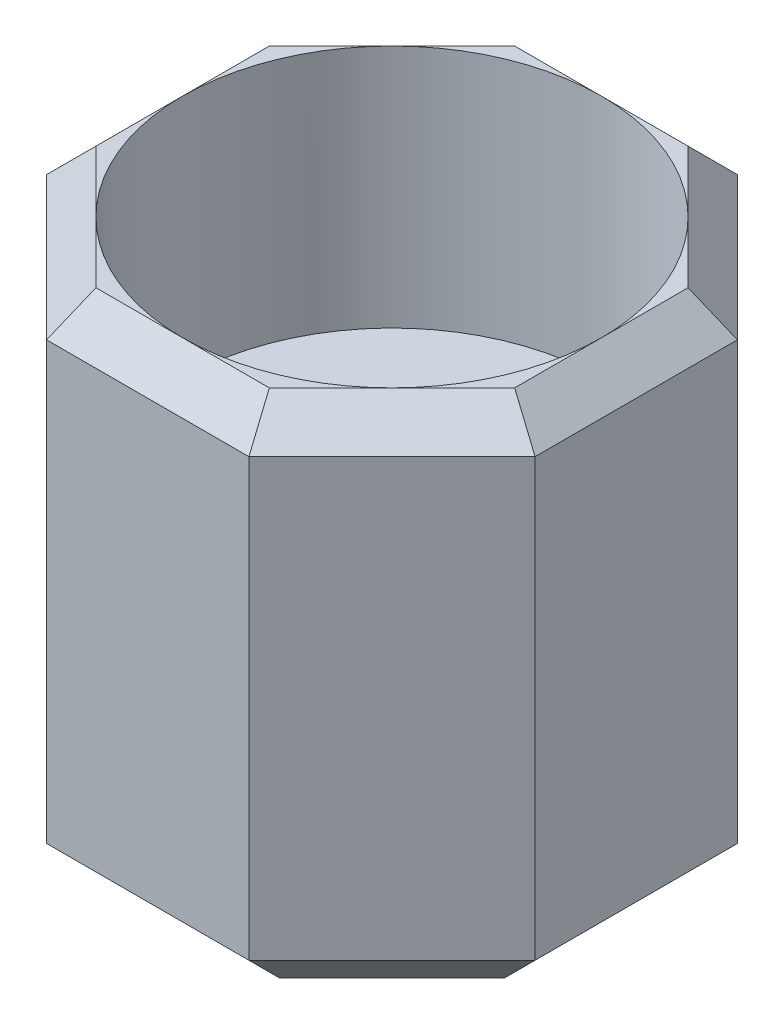
ISO-10303-21;
HEADER;
FILE_DESCRIPTION(('STEP AP214'),'2;1');
FILE_NAME('part.step','',(''),(''),'','','');
FILE_SCHEMA(('AUTOMOTIVE_DESIGN { 1 0 10303 214 1 1 1 1 }'));
ENDSEC;
DATA;
#1=APPLICATION_CONTEXT('core data for automotive mechanical design processes');
#2=APPLICATION_PROTOCOL_DEFINITION('international standard','automotive_design',2000,#1);
#3=PRODUCT_CONTEXT('',#1,'mechanical');
#4=PRODUCT('Part','Part','',(#3));
#5=PRODUCT_RELATED_PRODUCT_CATEGORY('part','',(#4));
#6=PRODUCT_DEFINITION_FORMATION('','',#4);
#7=PRODUCT_DEFINITION_CONTEXT('part definition',#1,'design');
#8=PRODUCT_DEFINITION('design','',#6,#7);
#9=PRODUCT_DEFINITION_SHAPE('','',#8);
#10=(LENGTH_UNIT() NAMED_UNIT(*) SI_UNIT(.MILLI.,.METRE.));
#11=(NAMED_UNIT(*) PLANE_ANGLE_UNIT() SI_UNIT($,.RADIAN.));
#12=(NAMED_UNIT(*) SI_UNIT($,.STERADIAN.) SOLID_ANGLE_UNIT());
#13=UNCERTAINTY_MEASURE_WITH_UNIT(LENGTH_MEASURE(1.E-05),#10,'distance_accuracy_value','');
#14=(GEOMETRIC_REPRESENTATION_CONTEXT(3) GLOBAL_UNCERTAINTY_ASSIGNED_CONTEXT((#13)) GLOBAL_UNIT_ASSIGNED_CONTEXT((#10,
#11,#12)) REPRESENTATION_CONTEXT('',''));
#15=CARTESIAN_POINT('',(0.,0.,0.));
#16=DIRECTION('',(0.,0.,1.));
#17=DIRECTION('',(1.,0.,0.));
#18=AXIS2_PLACEMENT_3D('',#15,#16,#17);
#19=CARTESIAN_POINT('',(0.,15.,0.));
#20=DIRECTION('',(0.,1.,0.));
#21=DIRECTION('',(0.,0.,1.));
#22=AXIS2_PLACEMENT_3D('',#19,#20,#21);
#23=PLANE('',#22);
#24=CARTESIAN_POINT('',(0.,15.,0.));
#25=DIRECTION('',(0.,1.,0.));
#26=DIRECTION('',(0.,0.,1.));
#27=AXIS2_PLACEMENT_3D('',#24,#25,#26);
#28=CIRCLE('',#27,6.);
#29=CARTESIAN_POINT('',(0.,15.,6.));
#30=VERTEX_POINT('',#29);
#31=CARTESIAN_POINT('',(4.24264068711928,15.,4.24264068711928));
#32=VERTEX_POINT('',#31);
#33=EDGE_CURVE('E449',#30,#32,#28,.T.);
#34=ORIENTED_EDGE('',*,*,#33,.F.);
#35=DIRECTION('',(1.,0.,0.));
#36=VECTOR('',#35,1.);
#37=CARTESIAN_POINT('',(2.89949493661167,15.,6.));
#38=LINE('',#37,#36);
#39=CARTESIAN_POINT('',(2.48528137423857,15.,6.));
#40=VERTEX_POINT('',#39);
#41=EDGE_CURVE('E249',#30,#40,#38,.T.);
#42=ORIENTED_EDGE('',*,*,#41,.T.);
#43=DIRECTION('',(0.707106781186548,0.,-0.707106781186548));
#44=VECTOR('',#43,1.);
#45=CARTESIAN_POINT('',(6.29289321881345,15.,2.19238815542512));
#46=LINE('',#45,#44);
#47=EDGE_CURVE('E254',#40,#32,#46,.T.);
#48=ORIENTED_EDGE('',*,*,#47,.T.);
#49=EDGE_LOOP('',(#34,#42,#48));
#50=FACE_BOUND('',#49,.T.);
#51=ADVANCED_FACE('F37',(#50),#23,.T.);
#52=CARTESIAN_POINT('',(6.,15.,0.));
#53=VERTEX_POINT('',#52);
#54=EDGE_CURVE('E454',#32,#53,#28,.T.);
#55=ORIENTED_EDGE('',*,*,#54,.F.);
#56=CARTESIAN_POINT('',(6.,15.,2.48528137423857));
#57=VERTEX_POINT('',#56);
#58=EDGE_CURVE('E253',#32,#57,#46,.T.);
#59=ORIENTED_EDGE('',*,*,#58,.T.);
#60=DIRECTION('',(0.,0.,-1.));
#61=VECTOR('',#60,1.);
#62=CARTESIAN_POINT('',(6.,15.,-2.89949493661166));
#63=LINE('',#62,#61);
#64=EDGE_CURVE('E258',#57,#53,#63,.T.);
#65=ORIENTED_EDGE('',*,*,#64,.T.);
#66=EDGE_LOOP('',(#55,#59,#65));
#67=FACE_BOUND('',#66,.T.);
#68=ADVANCED_FACE('F184',(#67),#23,.T.);
#69=CARTESIAN_POINT('',(4.24264068711928,15.,-4.24264068711928));
#70=VERTEX_POINT('',#69);
#71=EDGE_CURVE('E457',#53,#70,#28,.T.);
#72=ORIENTED_EDGE('',*,*,#71,.F.);
#73=CARTESIAN_POINT('',(6.,15.,-2.48528137423857));
#74=VERTEX_POINT('',#73);
#75=EDGE_CURVE('E257',#53,#74,#63,.T.);
#76=ORIENTED_EDGE('',*,*,#75,.T.);
#77=DIRECTION('',(-0.707106781186548,0.,-0.707106781186548));
#78=VECTOR('',#77,1.);
#79=CARTESIAN_POINT('',(4.24264068711928,15.,-4.24264068711928));
#80=LINE('',#79,#78);
#81=EDGE_CURVE('E397',#74,#70,#80,.T.);
#82=ORIENTED_EDGE('',*,*,#81,.T.);
#83=EDGE_LOOP('',(#72,#76,#82));
#84=FACE_BOUND('',#83,.T.);
#85=ADVANCED_FACE('F191',(#84),#23,.T.);
#86=CARTESIAN_POINT('',(0.,15.,-6.));
#87=VERTEX_POINT('',#86);
#88=EDGE_CURVE('E459',#70,#87,#28,.T.);
#89=ORIENTED_EDGE('',*,*,#88,.F.);
#90=CARTESIAN_POINT('',(2.48528137423857,15.,-6.));
#91=VERTEX_POINT('',#90);
#92=EDGE_CURVE('E396',#70,#91,#80,.T.);
#93=ORIENTED_EDGE('',*,*,#92,.T.);
#94=DIRECTION('',(-1.,0.,0.));
#95=VECTOR('',#94,1.);
#96=CARTESIAN_POINT('',(0.,15.,-6.));
#97=LINE('',#96,#95);
#98=EDGE_CURVE('E400',#91,#87,#97,.T.);
#99=ORIENTED_EDGE('',*,*,#98,.T.);
#100=EDGE_LOOP('',(#89,#93,#99));
#101=FACE_BOUND('',#100,.T.);
#102=ADVANCED_FACE('F612',(#101),#23,.T.);
#103=CARTESIAN_POINT('',(-4.24264068711928,15.,-4.24264068711928));
#104=VERTEX_POINT('',#103);
#105=EDGE_CURVE('E410',#87,#104,#28,.T.);
#106=ORIENTED_EDGE('',*,*,#105,.F.);
#107=CARTESIAN_POINT('',(-2.48528137423857,15.,-6.));
#108=VERTEX_POINT('',#107);
#109=EDGE_CURVE('E399',#87,#108,#97,.T.);
#110=ORIENTED_EDGE('',*,*,#109,.T.);
#111=DIRECTION('',(-0.707106781186548,0.,0.707106781186548));
#112=VECTOR('',#111,1.);
#113=CARTESIAN_POINT('',(-4.24264068711928,15.,-4.24264068711928));
#114=LINE('',#113,#112);
#115=EDGE_CURVE('E239',#108,#104,#114,.T.);
#116=ORIENTED_EDGE('',*,*,#115,.T.);
#117=EDGE_LOOP('',(#106,#110,#116));
#118=FACE_BOUND('',#117,.T.);
#119=ADVANCED_FACE('F220',(#118),#23,.T.);
#120=CARTESIAN_POINT('',(-6.,15.,0.));
#121=VERTEX_POINT('',#120);
#122=EDGE_CURVE('E228',#104,#121,#28,.T.);
#123=ORIENTED_EDGE('',*,*,#122,.F.);
#124=CARTESIAN_POINT('',(-6.,15.,-2.48528137423857));
#125=VERTEX_POINT('',#124);
#126=EDGE_CURVE('E243',#104,#125,#114,.T.);
#127=ORIENTED_EDGE('',*,*,#126,.T.);
#128=DIRECTION('',(0.,0.,1.));
#129=VECTOR('',#128,1.);
#130=CARTESIAN_POINT('',(-6.,15.,0.));
#131=LINE('',#130,#129);
#132=EDGE_CURVE('E234',#125,#121,#131,.T.);
#133=ORIENTED_EDGE('',*,*,#132,.T.);
#134=EDGE_LOOP('',(#123,#127,#133));
#135=FACE_BOUND('',#134,.T.);
#136=ADVANCED_FACE('F211',(#135),#23,.T.);
#137=CARTESIAN_POINT('',(-4.24264068711928,15.,4.24264068711928));
#138=VERTEX_POINT('',#137);
#139=EDGE_CURVE('E53',#121,#138,#28,.T.);
#140=ORIENTED_EDGE('',*,*,#139,.F.);
#141=CARTESIAN_POINT('',(-6.,15.,2.48528137423857));
#142=VERTEX_POINT('',#141);
#143=EDGE_CURVE('E224',#121,#142,#131,.T.);
#144=ORIENTED_EDGE('',*,*,#143,.T.);
#145=DIRECTION('',(0.707106781186548,0.,0.707106781186548));
#146=VECTOR('',#145,1.);
#147=CARTESIAN_POINT('',(-2.19238815542512,15.,6.29289321881345));
#148=LINE('',#147,#146);
#149=EDGE_CURVE('E227',#142,#138,#148,.T.);
#150=ORIENTED_EDGE('',*,*,#149,.T.);
#151=EDGE_LOOP('',(#140,#144,#150));
#152=FACE_BOUND('',#151,.T.);
#153=ADVANCED_FACE('F199',(#152),#23,.T.);
#154=CARTESIAN_POINT('',(4.94974746830583,15.,-4.94974746830583));
#155=DIRECTION('',(0.707106781186547,0.,-0.707106781186547));
#156=DIRECTION('',(-0.707106781186548,0.,-0.707106781186548));
#157=AXIS2_PLACEMENT_3D('',#154,#155,#156);
#158=PLANE('',#157);
#159=DIRECTION('',(0.,-1.,0.));
#160=VECTOR('',#159,1.);
#161=CARTESIAN_POINT('',(7.,15.,-2.89949493661166));
#162=LINE('',#161,#160);
#163=CARTESIAN_POINT('',(7.,14.,-2.89949493661166));
#164=VERTEX_POINT('',#163);
#165=CARTESIAN_POINT('',(7.,1.50000000000001,-2.89949493661166));
#166=VERTEX_POINT('',#165);
#167=EDGE_CURVE('E300',#164,#166,#162,.T.);
#168=ORIENTED_EDGE('',*,*,#167,.T.);
#169=DIRECTION('',(-0.707106781186548,0.,-0.707106781186548));
#170=VECTOR('',#169,1.);
#171=CARTESIAN_POINT('',(2.89949493661166,1.50000000000001,-7.));
#172=LINE('',#171,#170);
#173=CARTESIAN_POINT('',(2.89949493661166,1.50000000000001,-7.));
#174=VERTEX_POINT('',#173);
#175=EDGE_CURVE('E46',#166,#174,#172,.T.);
#176=ORIENTED_EDGE('',*,*,#175,.T.);
#177=DIRECTION('',(0.,-1.,0.));
#178=VECTOR('',#177,1.);
#179=CARTESIAN_POINT('',(2.89949493661166,15.,-7.));
#180=LINE('',#179,#178);
#181=CARTESIAN_POINT('',(2.89949493661166,14.,-7.));
#182=VERTEX_POINT('',#181);
#183=EDGE_CURVE('E393',#182,#174,#180,.T.);
#184=ORIENTED_EDGE('',*,*,#183,.F.);
#185=DIRECTION('',(0.707106781186548,0.,0.707106781186548));
#186=VECTOR('',#185,1.);
#187=CARTESIAN_POINT('',(4.94974746830583,14.,-4.94974746830583));
#188=LINE('',#187,#186);
#189=EDGE_CURVE('E276',#182,#164,#188,.T.);
#190=ORIENTED_EDGE('',*,*,#189,.T.);
#191=EDGE_LOOP('',(#168,#176,#184,#190));
#192=FACE_BOUND('',#191,.T.);
#193=ADVANCED_FACE('F210',(#192),#158,.T.);
#194=CARTESIAN_POINT('',(0.,15.,-7.));
#195=DIRECTION('',(0.,0.,-1.));
#196=DIRECTION('',(-1.,0.,0.));
#197=AXIS2_PLACEMENT_3D('',#194,#195,#196);
#198=PLANE('',#197);
#199=ORIENTED_EDGE('',*,*,#183,.T.);
#200=DIRECTION('',(-1.,0.,0.));
#201=VECTOR('',#200,1.);
#202=CARTESIAN_POINT('',(-2.89949493661167,1.50000000000001,-7.));
#203=LINE('',#202,#201);
#204=CARTESIAN_POINT('',(-2.89949493661167,1.50000000000001,-7.));
#205=VERTEX_POINT('',#204);
#206=EDGE_CURVE('E317',#174,#205,#203,.T.);
#207=ORIENTED_EDGE('',*,*,#206,.T.);
#208=DIRECTION('',(0.,-1.,0.));
#209=VECTOR('',#208,1.);
#210=CARTESIAN_POINT('',(-2.89949493661167,15.,-7.));
#211=LINE('',#210,#209);
#212=CARTESIAN_POINT('',(-2.89949493661167,14.,-7.));
#213=VERTEX_POINT('',#212);
#214=EDGE_CURVE('E390',#213,#205,#211,.T.);
#215=ORIENTED_EDGE('',*,*,#214,.F.);
#216=DIRECTION('',(1.,0.,0.));
#217=VECTOR('',#216,1.);
#218=CARTESIAN_POINT('',(0.,14.,-7.));
#219=LINE('',#218,#217);
#220=EDGE_CURVE('E274',#213,#182,#219,.T.);
#221=ORIENTED_EDGE('',*,*,#220,.T.);
#222=EDGE_LOOP('',(#199,#207,#215,#221));
#223=FACE_BOUND('',#222,.T.);
#224=ADVANCED_FACE('F217',(#223),#198,.T.);
#225=CARTESIAN_POINT('',(-4.94974746830583,15.,-4.94974746830583));
#226=DIRECTION('',(-0.707106781186547,0.,-0.707106781186547));
#227=DIRECTION('',(-0.707106781186548,0.,0.707106781186548));
#228=AXIS2_PLACEMENT_3D('',#225,#226,#227);
#229=PLANE('',#228);
#230=ORIENTED_EDGE('',*,*,#214,.T.);
#231=DIRECTION('',(-0.707106781186548,0.,0.707106781186548));
#232=VECTOR('',#231,1.);
#233=CARTESIAN_POINT('',(-7.,1.50000000000001,-2.89949493661167));
#234=LINE('',#233,#232);
#235=CARTESIAN_POINT('',(-7.,1.50000000000001,-2.89949493661167));
#236=VERTEX_POINT('',#235);
#237=EDGE_CURVE('E320',#205,#236,#234,.T.);
#238=ORIENTED_EDGE('',*,*,#237,.T.);
#239=DIRECTION('',(0.,-1.,0.));
#240=VECTOR('',#239,1.);
#241=CARTESIAN_POINT('',(-7.,15.,-2.89949493661167));
#242=LINE('',#241,#240);
#243=CARTESIAN_POINT('',(-7.,14.,-2.89949493661167));
#244=VERTEX_POINT('',#243);
#245=EDGE_CURVE('E387',#244,#236,#242,.T.);
#246=ORIENTED_EDGE('',*,*,#245,.F.);
#247=DIRECTION('',(0.707106781186548,0.,-0.707106781186548));
#248=VECTOR('',#247,1.);
#249=CARTESIAN_POINT('',(-4.94974746830583,14.,-4.94974746830583));
#250=LINE('',#249,#248);
#251=EDGE_CURVE('E272',#244,#213,#250,.T.);
#252=ORIENTED_EDGE('',*,*,#251,.T.);
#253=EDGE_LOOP('',(#230,#238,#246,#252));
#254=FACE_BOUND('',#253,.T.);
#255=ADVANCED_FACE('F438',(#254),#229,.T.);
#256=CARTESIAN_POINT('',(-7.,15.,0.));
#257=DIRECTION('',(-1.,0.,0.));
#258=DIRECTION('',(0.,0.,1.));
#259=AXIS2_PLACEMENT_3D('',#256,#257,#258);
#260=PLANE('',#259);
#261=ORIENTED_EDGE('',*,*,#245,.T.);
#262=DIRECTION('',(0.,0.,1.));
#263=VECTOR('',#262,1.);
#264=CARTESIAN_POINT('',(-7.,1.50000000000001,2.89949493661166));
#265=LINE('',#264,#263);
#266=CARTESIAN_POINT('',(-7.,1.50000000000001,2.89949493661166));
#267=VERTEX_POINT('',#266);
#268=EDGE_CURVE('E322',#236,#267,#265,.T.);
#269=ORIENTED_EDGE('',*,*,#268,.T.);
#270=DIRECTION('',(0.,-1.,0.));
#271=VECTOR('',#270,1.);
#272=CARTESIAN_POINT('',(-7.,15.,2.89949493661166));
#273=LINE('',#272,#271);
#274=CARTESIAN_POINT('',(-7.,14.,2.89949493661166));
#275=VERTEX_POINT('',#274);
#276=EDGE_CURVE('E380',#275,#267,#273,.T.);
#277=ORIENTED_EDGE('',*,*,#276,.F.);
#278=DIRECTION('',(0.,0.,-1.));
#279=VECTOR('',#278,1.);
#280=CARTESIAN_POINT('',(-7.,14.,0.));
#281=LINE('',#280,#279);
#282=EDGE_CURVE('E270',#275,#244,#281,.T.);
#283=ORIENTED_EDGE('',*,*,#282,.T.);
#284=EDGE_LOOP('',(#261,#269,#277,#283));
#285=FACE_BOUND('',#284,.T.);
#286=ADVANCED_FACE('F501',(#285),#260,.T.);
#287=CARTESIAN_POINT('',(-4.94974746830583,15.,4.94974746830583));
#288=DIRECTION('',(0.707106781186547,0.,-0.707106781186547));
#289=DIRECTION('',(-0.707106781186548,0.,-0.707106781186548));
#290=AXIS2_PLACEMENT_3D('',#287,#288,#289);
#291=PLANE('',#290);
#292=ORIENTED_EDGE('',*,*,#276,.T.);
#293=DIRECTION('',(0.707106781186548,0.,0.707106781186548));
#294=VECTOR('',#293,1.);
#295=CARTESIAN_POINT('',(-4.94974746830583,1.50000000000001,4.94974746830583));
#296=LINE('',#295,#294);
#297=CARTESIAN_POINT('',(-2.89949493661167,1.50000000000001,7.));
#298=VERTEX_POINT('',#297);
#299=EDGE_CURVE('E324',#267,#298,#296,.T.);
#300=ORIENTED_EDGE('',*,*,#299,.T.);
#301=DIRECTION('',(0.,-1.,0.));
#302=VECTOR('',#301,1.);
#303=CARTESIAN_POINT('',(-2.89949493661167,15.,7.));
#304=LINE('',#303,#302);
#305=CARTESIAN_POINT('',(-2.89949493661167,14.,7.));
#306=VERTEX_POINT('',#305);
#307=EDGE_CURVE('E373',#306,#298,#304,.T.);
#308=ORIENTED_EDGE('',*,*,#307,.F.);
#309=DIRECTION('',(-0.707106781186548,0.,-0.707106781186548));
#310=VECTOR('',#309,1.);
#311=CARTESIAN_POINT('',(-7.,14.,2.89949493661167));
#312=LINE('',#311,#310);
#313=EDGE_CURVE('E268',#306,#275,#312,.T.);
#314=ORIENTED_EDGE('',*,*,#313,.T.);
#315=EDGE_LOOP('',(#292,#300,#308,#314));
#316=FACE_BOUND('',#315,.T.);
#317=ADVANCED_FACE('F503',(#316),#291,.F.);
#318=CARTESIAN_POINT('',(0.,15.,7.));
#319=DIRECTION('',(0.,0.,-1.));
#320=DIRECTION('',(-1.,0.,0.));
#321=AXIS2_PLACEMENT_3D('',#318,#319,#320);
#322=PLANE('',#321);
#323=ORIENTED_EDGE('',*,*,#307,.T.);
#324=DIRECTION('',(1.,0.,0.));
#325=VECTOR('',#324,1.);
#326=CARTESIAN_POINT('',(0.,1.50000000000001,7.));
#327=LINE('',#326,#325);
#328=CARTESIAN_POINT('',(2.89949493661167,1.50000000000001,7.));
#329=VERTEX_POINT('',#328);
#330=EDGE_CURVE('E326',#298,#329,#327,.T.);
#331=ORIENTED_EDGE('',*,*,#330,.T.);
#332=DIRECTION('',(0.,-1.,0.));
#333=VECTOR('',#332,1.);
#334=CARTESIAN_POINT('',(2.89949493661167,15.,7.));
#335=LINE('',#334,#333);
#336=CARTESIAN_POINT('',(2.89949493661167,14.,7.));
#337=VERTEX_POINT('',#336);
#338=EDGE_CURVE('E370',#337,#329,#335,.T.);
#339=ORIENTED_EDGE('',*,*,#338,.F.);
#340=DIRECTION('',(-1.,0.,0.));
#341=VECTOR('',#340,1.);
#342=CARTESIAN_POINT('',(-2.89949493661167,14.,7.));
#343=LINE('',#342,#341);
#344=EDGE_CURVE('E266',#337,#306,#343,.T.);
#345=ORIENTED_EDGE('',*,*,#344,.T.);
#346=EDGE_LOOP('',(#323,#331,#339,#345));
#347=FACE_BOUND('',#346,.T.);
#348=ADVANCED_FACE('F369',(#347),#322,.F.);
#349=CARTESIAN_POINT('',(4.94974746830583,15.,4.94974746830583));
#350=DIRECTION('',(-0.707106781186547,0.,-0.707106781186547));
#351=DIRECTION('',(-0.707106781186548,0.,0.707106781186548));
#352=AXIS2_PLACEMENT_3D('',#349,#350,#351);
#353=PLANE('',#352);
#354=ORIENTED_EDGE('',*,*,#338,.T.);
#355=DIRECTION('',(0.707106781186548,0.,-0.707106781186548));
#356=VECTOR('',#355,1.);
#357=CARTESIAN_POINT('',(4.94974746830583,1.50000000000001,4.94974746830583));
#358=LINE('',#357,#356);
#359=CARTESIAN_POINT('',(7.,1.50000000000001,2.89949493661167));
#360=VERTEX_POINT('',#359);
#361=EDGE_CURVE('E328',#329,#360,#358,.T.);
#362=ORIENTED_EDGE('',*,*,#361,.T.);
#363=DIRECTION('',(0.,-1.,0.));
#364=VECTOR('',#363,1.);
#365=CARTESIAN_POINT('',(7.,15.,2.89949493661167));
#366=LINE('',#365,#364);
#367=CARTESIAN_POINT('',(7.,14.,2.89949493661167));
#368=VERTEX_POINT('',#367);
#369=EDGE_CURVE('E378',#368,#360,#366,.T.);
#370=ORIENTED_EDGE('',*,*,#369,.F.);
#371=DIRECTION('',(-0.707106781186548,0.,0.707106781186548));
#372=VECTOR('',#371,1.);
#373=CARTESIAN_POINT('',(2.89949493661167,14.,7.));
#374=LINE('',#373,#372);
#375=EDGE_CURVE('E264',#368,#337,#374,.T.);
#376=ORIENTED_EDGE('',*,*,#375,.T.);
#377=EDGE_LOOP('',(#354,#362,#370,#376));
#378=FACE_BOUND('',#377,.T.);
#379=ADVANCED_FACE('F206',(#378),#353,.F.);
#380=CARTESIAN_POINT('',(7.,15.,0.));
#381=DIRECTION('',(-1.,0.,0.));
#382=DIRECTION('',(0.,0.,1.));
#383=AXIS2_PLACEMENT_3D('',#380,#381,#382);
#384=PLANE('',#383);
#385=ORIENTED_EDGE('',*,*,#369,.T.);
#386=DIRECTION('',(0.,0.,-1.));
#387=VECTOR('',#386,1.);
#388=CARTESIAN_POINT('',(7.,1.50000000000001,0.));
#389=LINE('',#388,#387);
#390=EDGE_CURVE('E330',#360,#166,#389,.T.);
#391=ORIENTED_EDGE('',*,*,#390,.T.);
#392=ORIENTED_EDGE('',*,*,#167,.F.);
#393=DIRECTION('',(0.,0.,1.));
#394=VECTOR('',#393,1.);
#395=CARTESIAN_POINT('',(7.,14.,2.89949493661167));
#396=LINE('',#395,#394);
#397=EDGE_CURVE('E261',#164,#368,#396,.T.);
#398=ORIENTED_EDGE('',*,*,#397,.T.);
#399=EDGE_LOOP('',(#385,#391,#392,#398));
#400=FACE_BOUND('',#399,.T.);
#401=ADVANCED_FACE('F197',(#400),#384,.F.);
#402=EDGE_CURVE('E169',#138,#30,#28,.T.);
#403=ORIENTED_EDGE('',*,*,#402,.F.);
#404=CARTESIAN_POINT('',(-2.48528137423857,15.,6.));
#405=VERTEX_POINT('',#404);
#406=EDGE_CURVE('E244',#138,#405,#148,.T.);
#407=ORIENTED_EDGE('',*,*,#406,.T.);
#408=EDGE_CURVE('E250',#405,#30,#38,.T.);
#409=ORIENTED_EDGE('',*,*,#408,.T.);
#410=EDGE_LOOP('',(#403,#407,#409));
#411=FACE_BOUND('',#410,.T.);
#412=ADVANCED_FACE('F187',(#411),#23,.T.);
#413=CARTESIAN_POINT('',(0.,0.,0.));
#414=DIRECTION('',(0.,1.,0.));
#415=DIRECTION('',(0.,0.,1.));
#416=AXIS2_PLACEMENT_3D('',#413,#414,#415);
#417=PLANE('',#416);
#418=CARTESIAN_POINT('',(0.,0.,0.));
#419=DIRECTION('',(0.,-1.,0.));
#420=DIRECTION('',(0.,0.,-1.));
#421=AXIS2_PLACEMENT_3D('',#418,#419,#420);
#422=CIRCLE('',#421,3.5);
#423=CARTESIAN_POINT('',(0.,0.,-3.5));
#424=VERTEX_POINT('',#423);
#425=EDGE_CURVE('E451',#424,#424,#422,.T.);
#426=ORIENTED_EDGE('',*,*,#425,.F.);
#427=EDGE_LOOP('',(#426));
#428=FACE_BOUND('',#427,.T.);
#429=DIRECTION('',(0.707106781186548,0.,-0.707106781186548));
#430=VECTOR('',#429,1.);
#431=CARTESIAN_POINT('',(-1.83883476483184,0.,-5.93933982822017));
#432=LINE('',#431,#430);
#433=CARTESIAN_POINT('',(-5.49999999999999,0.,-2.27817459305202));
#434=VERTEX_POINT('',#433);
#435=CARTESIAN_POINT('',(-2.27817459305202,0.,-5.49999999999999));
#436=VERTEX_POINT('',#435);
#437=EDGE_CURVE('E312',#434,#436,#432,.T.);
#438=ORIENTED_EDGE('',*,*,#437,.T.);
#439=DIRECTION('',(1.,0.,0.));
#440=VECTOR('',#439,1.);
#441=CARTESIAN_POINT('',(2.89949493661166,0.,-5.49999999999999));
#442=LINE('',#441,#440);
#443=CARTESIAN_POINT('',(2.27817459305202,0.,-5.49999999999999));
#444=VERTEX_POINT('',#443);
#445=EDGE_CURVE('E314',#436,#444,#442,.T.);
#446=ORIENTED_EDGE('',*,*,#445,.T.);
#447=DIRECTION('',(0.707106781186548,0.,0.707106781186548));
#448=VECTOR('',#447,1.);
#449=CARTESIAN_POINT('',(5.93933982822017,0.,-1.83883476483184));
#450=LINE('',#449,#448);
#451=CARTESIAN_POINT('',(5.49999999999999,0.,-2.27817459305202));
#452=VERTEX_POINT('',#451);
#453=EDGE_CURVE('E278',#444,#452,#450,.T.);
#454=ORIENTED_EDGE('',*,*,#453,.T.);
#455=DIRECTION('',(0.,0.,1.));
#456=VECTOR('',#455,1.);
#457=CARTESIAN_POINT('',(5.49999999999999,0.,0.));
#458=LINE('',#457,#456);
#459=CARTESIAN_POINT('',(5.49999999999999,0.,2.27817459305202));
#460=VERTEX_POINT('',#459);
#461=EDGE_CURVE('E302',#452,#460,#458,.T.);
#462=ORIENTED_EDGE('',*,*,#461,.T.);
#463=DIRECTION('',(-0.707106781186548,0.,0.707106781186548));
#464=VECTOR('',#463,1.);
#465=CARTESIAN_POINT('',(3.88908729652601,0.,3.88908729652601));
#466=LINE('',#465,#464);
#467=CARTESIAN_POINT('',(2.27817459305202,0.,5.49999999999999));
#468=VERTEX_POINT('',#467);
#469=EDGE_CURVE('E304',#460,#468,#466,.T.);
#470=ORIENTED_EDGE('',*,*,#469,.T.);
#471=DIRECTION('',(-1.,0.,0.));
#472=VECTOR('',#471,1.);
#473=CARTESIAN_POINT('',(0.,0.,5.49999999999999));
#474=LINE('',#473,#472);
#475=CARTESIAN_POINT('',(-2.27817459305202,0.,5.49999999999999));
#476=VERTEX_POINT('',#475);
#477=EDGE_CURVE('E306',#468,#476,#474,.T.);
#478=ORIENTED_EDGE('',*,*,#477,.T.);
#479=DIRECTION('',(-0.707106781186548,0.,-0.707106781186548));
#480=VECTOR('',#479,1.);
#481=CARTESIAN_POINT('',(-3.88908729652601,0.,3.88908729652601));
#482=LINE('',#481,#480);
#483=CARTESIAN_POINT('',(-5.49999999999999,0.,2.27817459305202));
#484=VERTEX_POINT('',#483);
#485=EDGE_CURVE('E308',#476,#484,#482,.T.);
#486=ORIENTED_EDGE('',*,*,#485,.T.);
#487=DIRECTION('',(0.,0.,-1.));
#488=VECTOR('',#487,1.);
#489=CARTESIAN_POINT('',(-5.49999999999999,0.,-2.89949493661167));
#490=LINE('',#489,#488);
#491=EDGE_CURVE('E310',#484,#434,#490,.T.);
#492=ORIENTED_EDGE('',*,*,#491,.T.);
#493=EDGE_LOOP('',(#438,#446,#454,#462,#470,#478,#486,#492));
#494=FACE_BOUND('',#493,.T.);
#495=ADVANCED_FACE('F196',(#428,#494),#417,.F.);
#496=CARTESIAN_POINT('',(-7.,14.,0.));
#497=DIRECTION('',(0.707106781186547,-0.707106781186549,0.));
#498=DIRECTION('',(0.,0.,-1.));
#499=AXIS2_PLACEMENT_3D('',#496,#497,#498);
#500=PLANE('',#499);
#501=DIRECTION('',(0.678598344545848,0.678598344545846,0.281084637714821));
#502=VECTOR('',#501,1.);
#503=CARTESIAN_POINT('',(-6.4469399850851,14.5530600149149,-2.67040997762765));
#504=LINE('',#503,#502);
#505=EDGE_CURVE('E297',#244,#125,#504,.T.);
#506=ORIENTED_EDGE('',*,*,#505,.F.);
#507=ORIENTED_EDGE('',*,*,#282,.F.);
#508=DIRECTION('',(-0.678598344545848,-0.678598344545846,0.281084637714821));
#509=VECTOR('',#508,1.);
#510=CARTESIAN_POINT('',(-6.4469399850851,14.5530600149149,2.67040997762765));
#511=LINE('',#510,#509);
#512=EDGE_CURVE('E238',#142,#275,#511,.T.);
#513=ORIENTED_EDGE('',*,*,#512,.F.);
#514=ORIENTED_EDGE('',*,*,#143,.F.);
#515=ORIENTED_EDGE('',*,*,#132,.F.);
#516=EDGE_LOOP('',(#506,#507,#513,#514,#515));
#517=FACE_BOUND('',#516,.T.);
#518=ADVANCED_FACE('F204',(#517),#500,.F.);
#519=CARTESIAN_POINT('',(-4.24264068711928,15.,4.24264068711928));
#520=DIRECTION('',(-0.499999999999999,0.707106781186549,0.499999999999999));
#521=DIRECTION('',(-0.707106781186548,0.,-0.707106781186548));
#522=AXIS2_PLACEMENT_3D('',#519,#520,#521);
#523=PLANE('',#522);
#524=ORIENTED_EDGE('',*,*,#512,.T.);
#525=ORIENTED_EDGE('',*,*,#313,.F.);
#526=DIRECTION('',(0.281084637714821,0.678598344545846,-0.678598344545848));
#527=VECTOR('',#526,1.);
#528=CARTESIAN_POINT('',(-2.28892283796655,15.4740514413556,5.52594855864436));
#529=LINE('',#528,#527);
#530=EDGE_CURVE('E294',#405,#306,#529,.F.);
#531=ORIENTED_EDGE('',*,*,#530,.F.);
#532=ORIENTED_EDGE('',*,*,#406,.F.);
#533=ORIENTED_EDGE('',*,*,#149,.F.);
#534=EDGE_LOOP('',(#524,#525,#531,#532,#533));
#535=FACE_BOUND('',#534,.T.);
#536=ADVANCED_FACE('F444',(#535),#523,.T.);
#537=CARTESIAN_POINT('',(-4.94974746830583,14.,-4.94974746830583));
#538=DIRECTION('',(0.499999999999999,-0.707106781186549,0.499999999999999));
#539=DIRECTION('',(0.707106781186548,0.,-0.707106781186548));
#540=AXIS2_PLACEMENT_3D('',#537,#538,#539);
#541=PLANE('',#540);
#542=ORIENTED_EDGE('',*,*,#505,.T.);
#543=ORIENTED_EDGE('',*,*,#126,.F.);
#544=ORIENTED_EDGE('',*,*,#115,.F.);
#545=DIRECTION('',(0.281084637714821,0.678598344545846,0.678598344545848));
#546=VECTOR('',#545,1.);
#547=CARTESIAN_POINT('',(-2.67040997762765,14.5530600149149,-6.4469399850851));
#548=LINE('',#547,#546);
#549=EDGE_CURVE('E291',#213,#108,#548,.T.);
#550=ORIENTED_EDGE('',*,*,#549,.F.);
#551=ORIENTED_EDGE('',*,*,#251,.F.);
#552=EDGE_LOOP('',(#542,#543,#544,#550,#551));
#553=FACE_BOUND('',#552,.T.);
#554=ADVANCED_FACE('F414',(#553),#541,.F.);
#555=CARTESIAN_POINT('',(0.,15.,6.));
#556=DIRECTION('',(0.,0.707106781186549,0.707106781186547));
#557=DIRECTION('',(-1.,0.,0.));
#558=AXIS2_PLACEMENT_3D('',#555,#556,#557);
#559=PLANE('',#558);
#560=ORIENTED_EDGE('',*,*,#530,.T.);
#561=ORIENTED_EDGE('',*,*,#344,.F.);
#562=DIRECTION('',(-0.281084637714821,0.678598344545846,-0.678598344545848));
#563=VECTOR('',#562,1.);
#564=CARTESIAN_POINT('',(2.28892283796655,15.4740514413556,5.52594855864436));
#565=LINE('',#564,#563);
#566=EDGE_CURVE('E288',#40,#337,#565,.F.);
#567=ORIENTED_EDGE('',*,*,#566,.F.);
#568=ORIENTED_EDGE('',*,*,#41,.F.);
#569=ORIENTED_EDGE('',*,*,#408,.F.);
#570=EDGE_LOOP('',(#560,#561,#567,#568,#569));
#571=FACE_BOUND('',#570,.T.);
#572=ADVANCED_FACE('F532',(#571),#559,.T.);
#573=CARTESIAN_POINT('',(0.,14.,-7.));
#574=DIRECTION('',(0.,-0.707106781186549,0.707106781186547));
#575=DIRECTION('',(1.,0.,0.));
#576=AXIS2_PLACEMENT_3D('',#573,#574,#575);
#577=PLANE('',#576);
#578=ORIENTED_EDGE('',*,*,#549,.T.);
#579=ORIENTED_EDGE('',*,*,#109,.F.);
#580=ORIENTED_EDGE('',*,*,#98,.F.);
#581=DIRECTION('',(-0.281084637714821,0.678598344545846,0.678598344545848));
#582=VECTOR('',#581,1.);
#583=CARTESIAN_POINT('',(2.67040997762764,14.5530600149149,-6.4469399850851));
#584=LINE('',#583,#582);
#585=EDGE_CURVE('E285',#182,#91,#584,.T.);
#586=ORIENTED_EDGE('',*,*,#585,.F.);
#587=ORIENTED_EDGE('',*,*,#220,.F.);
#588=EDGE_LOOP('',(#578,#579,#580,#586,#587));
#589=FACE_BOUND('',#588,.T.);
#590=ADVANCED_FACE('F417',(#589),#577,.F.);
#591=CARTESIAN_POINT('',(4.24264068711928,15.,4.24264068711928));
#592=DIRECTION('',(0.499999999999999,0.707106781186549,0.499999999999999));
#593=DIRECTION('',(-0.707106781186548,0.,0.707106781186548));
#594=AXIS2_PLACEMENT_3D('',#591,#592,#593);
#595=PLANE('',#594);
#596=ORIENTED_EDGE('',*,*,#566,.T.);
#597=ORIENTED_EDGE('',*,*,#375,.F.);
#598=DIRECTION('',(-0.678598344545848,0.678598344545846,-0.281084637714821));
#599=VECTOR('',#598,1.);
#600=CARTESIAN_POINT('',(5.52594855864436,15.4740514413556,2.28892283796655));
#601=LINE('',#600,#599);
#602=EDGE_CURVE('E282',#57,#368,#601,.F.);
#603=ORIENTED_EDGE('',*,*,#602,.F.);
#604=ORIENTED_EDGE('',*,*,#58,.F.);
#605=ORIENTED_EDGE('',*,*,#47,.F.);
#606=EDGE_LOOP('',(#596,#597,#603,#604,#605));
#607=FACE_BOUND('',#606,.T.);
#608=ADVANCED_FACE('F525',(#607),#595,.T.);
#609=CARTESIAN_POINT('',(4.94974746830583,14.,-4.94974746830583));
#610=DIRECTION('',(-0.499999999999999,-0.707106781186549,0.499999999999999));
#611=DIRECTION('',(0.707106781186548,0.,0.707106781186548));
#612=AXIS2_PLACEMENT_3D('',#609,#610,#611);
#613=PLANE('',#612);
#614=ORIENTED_EDGE('',*,*,#585,.T.);
#615=ORIENTED_EDGE('',*,*,#92,.F.);
#616=ORIENTED_EDGE('',*,*,#81,.F.);
#617=DIRECTION('',(-0.678598344545848,0.678598344545846,0.281084637714821));
#618=VECTOR('',#617,1.);
#619=CARTESIAN_POINT('',(6.4469399850851,14.5530600149149,-2.67040997762765));
#620=LINE('',#619,#618);
#621=EDGE_CURVE('E279',#164,#74,#620,.T.);
#622=ORIENTED_EDGE('',*,*,#621,.F.);
#623=ORIENTED_EDGE('',*,*,#189,.F.);
#624=EDGE_LOOP('',(#614,#615,#616,#622,#623));
#625=FACE_BOUND('',#624,.T.);
#626=ADVANCED_FACE('F521',(#625),#613,.F.);
#627=CARTESIAN_POINT('',(6.,15.,0.));
#628=DIRECTION('',(0.707106781186547,0.707106781186549,0.));
#629=DIRECTION('',(0.,0.,1.));
#630=AXIS2_PLACEMENT_3D('',#627,#628,#629);
#631=PLANE('',#630);
#632=ORIENTED_EDGE('',*,*,#602,.T.);
#633=ORIENTED_EDGE('',*,*,#397,.F.);
#634=ORIENTED_EDGE('',*,*,#621,.T.);
#635=ORIENTED_EDGE('',*,*,#75,.F.);
#636=ORIENTED_EDGE('',*,*,#64,.F.);
#637=EDGE_LOOP('',(#632,#633,#634,#635,#636));
#638=FACE_BOUND('',#637,.T.);
#639=ADVANCED_FACE('F518',(#638),#631,.T.);
#640=CARTESIAN_POINT('',(0.,1.50000000000001,7.));
#641=DIRECTION('',(0.,0.707106781186547,-0.707106781186548));
#642=DIRECTION('',(1.,0.,0.));
#643=AXIS2_PLACEMENT_3D('',#640,#641,#642);
#644=PLANE('',#643);
#645=DIRECTION('',(-0.28108463771482,-0.678598344545847,-0.678598344545847));
#646=VECTOR('',#645,1.);
#647=CARTESIAN_POINT('',(2.67040997762765,0.946939985085107,6.4469399850851));
#648=LINE('',#647,#646);
#649=EDGE_CURVE('E350',#329,#468,#648,.T.);
#650=ORIENTED_EDGE('',*,*,#649,.F.);
#651=ORIENTED_EDGE('',*,*,#330,.F.);
#652=DIRECTION('',(0.28108463771482,-0.678598344545847,-0.678598344545847));
#653=VECTOR('',#652,1.);
#654=CARTESIAN_POINT('',(-2.67040997762765,0.946939985085105,6.4469399850851));
#655=LINE('',#654,#653);
#656=EDGE_CURVE('E283',#476,#298,#655,.F.);
#657=ORIENTED_EDGE('',*,*,#656,.F.);
#658=ORIENTED_EDGE('',*,*,#477,.F.);
#659=EDGE_LOOP('',(#650,#651,#657,#658));
#660=FACE_BOUND('',#659,.T.);
#661=ADVANCED_FACE('F363',(#660),#644,.F.);
#662=CARTESIAN_POINT('',(-4.94974746830583,1.50000000000001,4.94974746830583));
#663=DIRECTION('',(0.5,0.707106781186547,-0.5));
#664=DIRECTION('',(0.707106781186548,0.,0.707106781186548));
#665=AXIS2_PLACEMENT_3D('',#662,#663,#664);
#666=PLANE('',#665);
#667=ORIENTED_EDGE('',*,*,#656,.T.);
#668=ORIENTED_EDGE('',*,*,#299,.F.);
#669=DIRECTION('',(-0.678598344545847,0.678598344545847,0.28108463771482));
#670=VECTOR('',#669,1.);
#671=CARTESIAN_POINT('',(-6.4469399850851,0.946939985085106,2.67040997762765));
#672=LINE('',#671,#670);
#673=EDGE_CURVE('E347',#484,#267,#672,.T.);
#674=ORIENTED_EDGE('',*,*,#673,.F.);
#675=ORIENTED_EDGE('',*,*,#485,.F.);
#676=EDGE_LOOP('',(#667,#668,#674,#675));
#677=FACE_BOUND('',#676,.T.);
#678=ADVANCED_FACE('F357',(#677),#666,.F.);
#679=CARTESIAN_POINT('',(4.94974746830583,1.50000000000001,4.94974746830583));
#680=DIRECTION('',(-0.5,0.707106781186547,-0.5));
#681=DIRECTION('',(0.707106781186548,0.,-0.707106781186548));
#682=AXIS2_PLACEMENT_3D('',#679,#680,#681);
#683=PLANE('',#682);
#684=ORIENTED_EDGE('',*,*,#649,.T.);
#685=ORIENTED_EDGE('',*,*,#469,.F.);
#686=DIRECTION('',(-0.678598344545847,-0.678598344545847,-0.28108463771482));
#687=VECTOR('',#686,1.);
#688=CARTESIAN_POINT('',(6.4469399850851,0.946939985085105,2.67040997762765));
#689=LINE('',#688,#687);
#690=EDGE_CURVE('E344',#360,#460,#689,.T.);
#691=ORIENTED_EDGE('',*,*,#690,.F.);
#692=ORIENTED_EDGE('',*,*,#361,.F.);
#693=EDGE_LOOP('',(#684,#685,#691,#692));
#694=FACE_BOUND('',#693,.T.);
#695=ADVANCED_FACE('F552',(#694),#683,.F.);
#696=CARTESIAN_POINT('',(-5.49999999999999,0.,0.));
#697=DIRECTION('',(-0.707106781186548,-0.707106781186547,0.));
#698=DIRECTION('',(0.,0.,1.));
#699=AXIS2_PLACEMENT_3D('',#696,#697,#698);
#700=PLANE('',#699);
#701=ORIENTED_EDGE('',*,*,#673,.T.);
#702=ORIENTED_EDGE('',*,*,#268,.F.);
#703=DIRECTION('',(0.678598344545847,-0.678598344545847,0.28108463771482));
#704=VECTOR('',#703,1.);
#705=CARTESIAN_POINT('',(-5.065452845424,-0.434547154575994,-2.098179268136));
#706=LINE('',#705,#704);
#707=EDGE_CURVE('E341',#434,#236,#706,.F.);
#708=ORIENTED_EDGE('',*,*,#707,.F.);
#709=ORIENTED_EDGE('',*,*,#491,.F.);
#710=EDGE_LOOP('',(#701,#702,#708,#709));
#711=FACE_BOUND('',#710,.T.);
#712=ADVANCED_FACE('F500',(#711),#700,.T.);
#713=CARTESIAN_POINT('',(7.,1.50000000000001,0.));
#714=DIRECTION('',(-0.707106781186548,0.707106781186547,0.));
#715=DIRECTION('',(0.,0.,-1.));
#716=AXIS2_PLACEMENT_3D('',#713,#714,#715);
#717=PLANE('',#716);
#718=ORIENTED_EDGE('',*,*,#690,.T.);
#719=ORIENTED_EDGE('',*,*,#461,.F.);
#720=DIRECTION('',(0.678598344545846,0.678598344545847,-0.28108463771482));
#721=VECTOR('',#720,1.);
#722=CARTESIAN_POINT('',(5.065452845424,-0.434547154575993,-2.098179268136));
#723=LINE('',#722,#721);
#724=EDGE_CURVE('E338',#166,#452,#723,.F.);
#725=ORIENTED_EDGE('',*,*,#724,.F.);
#726=ORIENTED_EDGE('',*,*,#390,.F.);
#727=EDGE_LOOP('',(#718,#719,#725,#726));
#728=FACE_BOUND('',#727,.T.);
#729=ADVANCED_FACE('F546',(#728),#717,.F.);
#730=CARTESIAN_POINT('',(-3.88908729652601,0.,-3.88908729652601));
#731=DIRECTION('',(-0.5,-0.707106781186547,-0.5));
#732=DIRECTION('',(-0.707106781186548,0.,0.707106781186548));
#733=AXIS2_PLACEMENT_3D('',#730,#731,#732);
#734=PLANE('',#733);
#735=ORIENTED_EDGE('',*,*,#707,.T.);
#736=ORIENTED_EDGE('',*,*,#237,.F.);
#737=DIRECTION('',(0.28108463771482,-0.678598344545847,0.678598344545847));
#738=VECTOR('',#737,1.);
#739=CARTESIAN_POINT('',(-2.09817926813601,-0.434547154575994,-5.065452845424));
#740=LINE('',#739,#738);
#741=EDGE_CURVE('E335',#436,#205,#740,.F.);
#742=ORIENTED_EDGE('',*,*,#741,.F.);
#743=ORIENTED_EDGE('',*,*,#437,.F.);
#744=EDGE_LOOP('',(#735,#736,#742,#743));
#745=FACE_BOUND('',#744,.T.);
#746=ADVANCED_FACE('F497',(#745),#734,.T.);
#747=CARTESIAN_POINT('',(3.88908729652601,0.,-3.88908729652601));
#748=DIRECTION('',(0.5,-0.707106781186547,-0.5));
#749=DIRECTION('',(-0.707106781186548,0.,-0.707106781186548));
#750=AXIS2_PLACEMENT_3D('',#747,#748,#749);
#751=PLANE('',#750);
#752=ORIENTED_EDGE('',*,*,#724,.T.);
#753=ORIENTED_EDGE('',*,*,#453,.F.);
#754=DIRECTION('',(0.28108463771482,0.678598344545847,-0.678598344545846));
#755=VECTOR('',#754,1.);
#756=CARTESIAN_POINT('',(2.098179268136,-0.434547154575994,-5.065452845424));
#757=LINE('',#756,#755);
#758=EDGE_CURVE('E333',#174,#444,#757,.F.);
#759=ORIENTED_EDGE('',*,*,#758,.F.);
#760=ORIENTED_EDGE('',*,*,#175,.F.);
#761=EDGE_LOOP('',(#752,#753,#759,#760));
#762=FACE_BOUND('',#761,.T.);
#763=ADVANCED_FACE('F430',(#762),#751,.T.);
#764=CARTESIAN_POINT('',(0.,0.,-5.49999999999999));
#765=DIRECTION('',(0.,-0.707106781186547,-0.707106781186548));
#766=DIRECTION('',(-1.,0.,0.));
#767=AXIS2_PLACEMENT_3D('',#764,#765,#766);
#768=PLANE('',#767);
#769=ORIENTED_EDGE('',*,*,#741,.T.);
#770=ORIENTED_EDGE('',*,*,#206,.F.);
#771=ORIENTED_EDGE('',*,*,#758,.T.);
#772=ORIENTED_EDGE('',*,*,#445,.F.);
#773=EDGE_LOOP('',(#769,#770,#771,#772));
#774=FACE_BOUND('',#773,.T.);
#775=ADVANCED_FACE('F434',(#774),#768,.T.);
#776=CARTESIAN_POINT('',(0.,8.,0.));
#777=DIRECTION('',(0.,1.,0.));
#778=DIRECTION('',(0.,0.,1.));
#779=AXIS2_PLACEMENT_3D('',#776,#777,#778);
#780=CYLINDRICAL_SURFACE('',#779,6.);
#781=CARTESIAN_POINT('',(0.,8.,0.));
#782=DIRECTION('',(0.,1.,0.));
#783=DIRECTION('',(0.,0.,1.));
#784=AXIS2_PLACEMENT_3D('',#781,#782,#783);
#785=CIRCLE('',#784,6.);
#786=CARTESIAN_POINT('',(0.,8.,6.));
#787=VERTEX_POINT('',#786);
#788=EDGE_CURVE('E336',#787,#787,#785,.T.);
#789=ORIENTED_EDGE('',*,*,#788,.F.);
#790=EDGE_LOOP('',(#789));
#791=FACE_BOUND('',#790,.T.);
#792=ORIENTED_EDGE('',*,*,#33,.T.);
#793=ORIENTED_EDGE('',*,*,#54,.T.);
#794=ORIENTED_EDGE('',*,*,#71,.T.);
#795=ORIENTED_EDGE('',*,*,#88,.T.);
#796=ORIENTED_EDGE('',*,*,#105,.T.);
#797=ORIENTED_EDGE('',*,*,#122,.T.);
#798=ORIENTED_EDGE('',*,*,#139,.T.);
#799=ORIENTED_EDGE('',*,*,#402,.T.);
#800=EDGE_LOOP('',(#792,#793,#794,#795,#796,#797,#798,#799));
#801=FACE_BOUND('',#800,.T.);
#802=ADVANCED_FACE('F460',(#791,#801),#780,.F.);
#803=CARTESIAN_POINT('',(0.,8.,0.));
#804=DIRECTION('',(0.,1.,0.));
#805=DIRECTION('',(0.,0.,1.));
#806=AXIS2_PLACEMENT_3D('',#803,#804,#805);
#807=PLANE('',#806);
#808=ORIENTED_EDGE('',*,*,#788,.T.);
#809=EDGE_LOOP('',(#808));
#810=FACE_BOUND('',#809,.T.);
#811=ADVANCED_FACE('F462',(#810),#807,.T.);
#812=CARTESIAN_POINT('',(0.,4.5,0.));
#813=DIRECTION('',(0.,-1.,0.));
#814=DIRECTION('',(0.,0.,-1.));
#815=AXIS2_PLACEMENT_3D('',#812,#813,#814);
#816=CYLINDRICAL_SURFACE('',#815,3.5);
#817=CARTESIAN_POINT('',(0.,4.5,0.));
#818=DIRECTION('',(0.,-1.,0.));
#819=DIRECTION('',(0.,0.,-1.));
#820=AXIS2_PLACEMENT_3D('',#817,#818,#819);
#821=CIRCLE('',#820,3.5);
#822=CARTESIAN_POINT('',(0.,4.5,-3.5));
#823=VERTEX_POINT('',#822);
#824=EDGE_CURVE('E448',#823,#823,#821,.T.);
#825=ORIENTED_EDGE('',*,*,#824,.F.);
#826=EDGE_LOOP('',(#825));
#827=FACE_BOUND('',#826,.T.);
#828=ORIENTED_EDGE('',*,*,#425,.T.);
#829=EDGE_LOOP('',(#828));
#830=FACE_BOUND('',#829,.T.);
#831=ADVANCED_FACE('F468',(#827,#830),#816,.F.);
#832=CARTESIAN_POINT('',(0.,4.5,0.));
#833=DIRECTION('',(0.,-1.,0.));
#834=DIRECTION('',(0.,0.,-1.));
#835=AXIS2_PLACEMENT_3D('',#832,#833,#834);
#836=PLANE('',#835);
#837=CARTESIAN_POINT('',(0.,4.5,0.));
#838=DIRECTION('',(0.,-1.,0.));
#839=DIRECTION('',(0.,0.,-1.));
#840=AXIS2_PLACEMENT_3D('',#837,#838,#839);
#841=CIRCLE('',#840,1.);
#842=CARTESIAN_POINT('',(0.,4.5,-1.));
#843=VERTEX_POINT('',#842);
#844=EDGE_CURVE('E484',#843,#843,#841,.T.);
#845=ORIENTED_EDGE('',*,*,#844,.F.);
#846=EDGE_LOOP('',(#845));
#847=FACE_BOUND('',#846,.T.);
#848=ORIENTED_EDGE('',*,*,#824,.T.);
#849=EDGE_LOOP('',(#848));
#850=FACE_BOUND('',#849,.T.);
#851=ADVANCED_FACE('F179',(#847,#850),#836,.T.);
#852=CARTESIAN_POINT('',(0.,6.,0.));
#853=DIRECTION('',(0.,-1.,0.));
#854=DIRECTION('',(0.,0.,-1.));
#855=AXIS2_PLACEMENT_3D('',#852,#853,#854);
#856=CYLINDRICAL_SURFACE('',#855,1.);
#857=CARTESIAN_POINT('',(0.,5.,0.));
#858=DIRECTION('',(0.,-1.,0.));
#859=DIRECTION('',(0.,0.,-1.));
#860=AXIS2_PLACEMENT_3D('',#857,#858,#859);
#861=CIRCLE('',#860,1.);
#862=CARTESIAN_POINT('',(0.,5.,-1.));
#863=VERTEX_POINT('',#862);
#864=EDGE_CURVE('E11',#863,#863,#861,.F.);
#865=ORIENTED_EDGE('',*,*,#864,.T.);
#866=EDGE_LOOP('',(#865));
#867=FACE_BOUND('',#866,.T.);
#868=ORIENTED_EDGE('',*,*,#844,.T.);
#869=EDGE_LOOP('',(#868));
#870=FACE_BOUND('',#869,.T.);
#871=ADVANCED_FACE('F174',(#867,#870),#856,.F.);
#872=CARTESIAN_POINT('',(0.,5.,0.));
#873=DIRECTION('',(0.,-1.,0.));
#874=DIRECTION('',(0.,0.,-1.));
#875=AXIS2_PLACEMENT_3D('',#872,#873,#874);
#876=CONICAL_SURFACE('',#875,1.00000000000001,0.785398163397455);
#877=ORIENTED_EDGE('',*,*,#864,.F.);
#878=EDGE_LOOP('',(#877));
#879=FACE_BOUND('',#878,.T.);
#880=CARTESIAN_POINT('',(0.,6.,0.));
#881=VERTEX_POINT('',#880);
#882=VERTEX_LOOP('',#881);
#883=FACE_BOUND('',#882,.T.);
#884=ADVANCED_FACE('F39',(#879,#883),#876,.F.);
#885=CLOSED_SHELL('',(#51,#68,#85,#102,#119,#136,#153,#193,#224,#255,#286,#317,#348,#379,#401,
#412,#495,#518,#536,#554,#572,#590,#608,#626,#639,#661,#678,#695,#712,#729,#746,#763,#775,#802,
#811,#831,#851,#871,#884));
#886=MANIFOLD_SOLID_BREP('B2',#885);
#887=ADVANCED_BREP_SHAPE_REPRESENTATION('',(#18,#886),#14);
#888=SHAPE_DEFINITION_REPRESENTATION(#9,#887);
ENDSEC;
END-ISO-10303-21;
